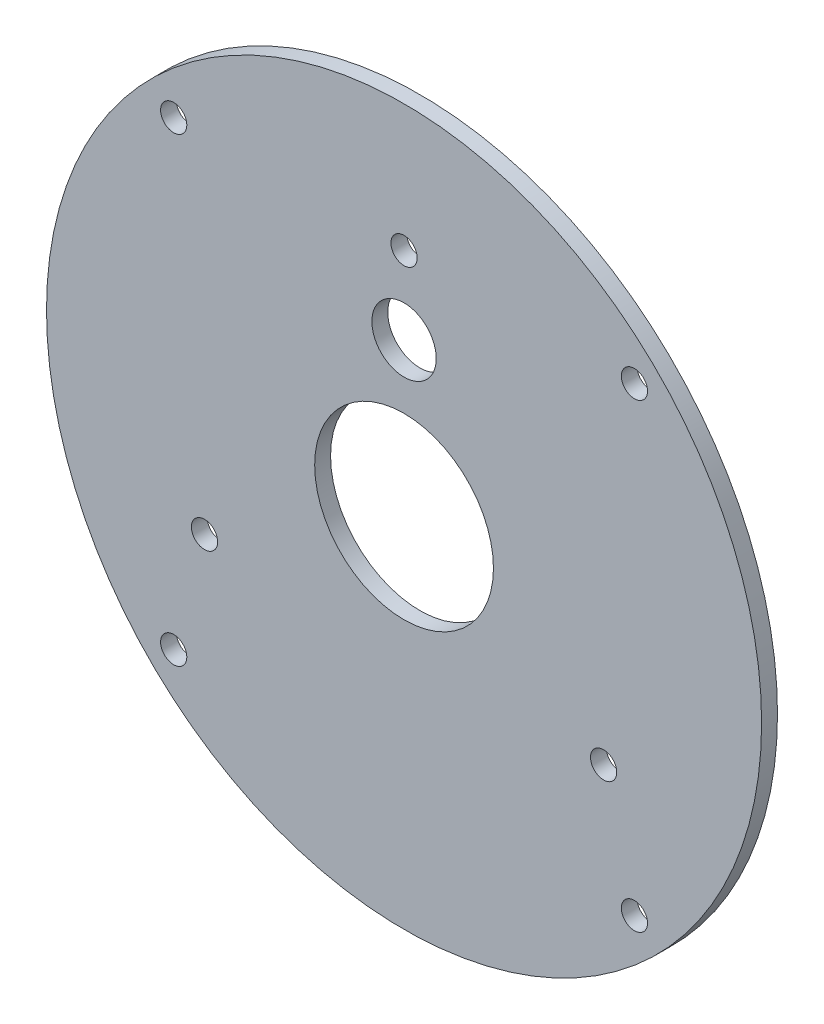
ISO-10303-21;
HEADER;
FILE_DESCRIPTION(('STEP AP214'),'2;1');
FILE_NAME('part.step','',(''),(''),'','','');
FILE_SCHEMA(('AUTOMOTIVE_DESIGN { 1 0 10303 214 1 1 1 1 }'));
ENDSEC;
DATA;
#1=APPLICATION_CONTEXT('core data for automotive mechanical design processes');
#2=APPLICATION_PROTOCOL_DEFINITION('international standard','automotive_design',2000,#1);
#3=PRODUCT_CONTEXT('',#1,'mechanical');
#4=PRODUCT('Part','Part','',(#3));
#5=PRODUCT_RELATED_PRODUCT_CATEGORY('part','',(#4));
#6=PRODUCT_DEFINITION_FORMATION('','',#4);
#7=PRODUCT_DEFINITION_CONTEXT('part definition',#1,'design');
#8=PRODUCT_DEFINITION('design','',#6,#7);
#9=PRODUCT_DEFINITION_SHAPE('','',#8);
#10=(LENGTH_UNIT() NAMED_UNIT(*) SI_UNIT(.MILLI.,.METRE.));
#11=(NAMED_UNIT(*) PLANE_ANGLE_UNIT() SI_UNIT($,.RADIAN.));
#12=(NAMED_UNIT(*) SI_UNIT($,.STERADIAN.) SOLID_ANGLE_UNIT());
#13=UNCERTAINTY_MEASURE_WITH_UNIT(LENGTH_MEASURE(1.E-05),#10,'distance_accuracy_value','');
#14=(GEOMETRIC_REPRESENTATION_CONTEXT(3) GLOBAL_UNCERTAINTY_ASSIGNED_CONTEXT((#13)) GLOBAL_UNIT_ASSIGNED_CONTEXT((#10,
#11,#12)) REPRESENTATION_CONTEXT('',''));
#15=CARTESIAN_POINT('',(0.,0.,0.));
#16=DIRECTION('',(0.,0.,1.));
#17=DIRECTION('',(1.,0.,0.));
#18=AXIS2_PLACEMENT_3D('',#15,#16,#17);
#19=CARTESIAN_POINT('',(0.,0.,10.));
#20=DIRECTION('',(0.,0.,-1.));
#21=DIRECTION('',(-1.,0.,0.));
#22=AXIS2_PLACEMENT_3D('',#19,#20,#21);
#23=CYLINDRICAL_SURFACE('',#22,45.);
#24=CARTESIAN_POINT('',(0.,0.,10.));
#25=DIRECTION('',(0.,0.,1.));
#26=DIRECTION('',(1.,0.,0.));
#27=AXIS2_PLACEMENT_3D('',#24,#25,#26);
#28=CIRCLE('',#27,45.);
#29=CARTESIAN_POINT('',(45.,0.,10.));
#30=VERTEX_POINT('',#29);
#31=EDGE_CURVE('E10',#30,#30,#28,.T.);
#32=ORIENTED_EDGE('',*,*,#31,.F.);
#33=EDGE_LOOP('',(#32));
#34=FACE_BOUND('',#33,.T.);
#35=CARTESIAN_POINT('',(0.,0.,8.));
#36=DIRECTION('',(0.,0.,-1.));
#37=DIRECTION('',(-1.,0.,0.));
#38=AXIS2_PLACEMENT_3D('',#35,#36,#37);
#39=CIRCLE('',#38,45.);
#40=CARTESIAN_POINT('',(-45.,0.,8.));
#41=VERTEX_POINT('',#40);
#42=EDGE_CURVE('E88',#41,#41,#39,.T.);
#43=ORIENTED_EDGE('',*,*,#42,.F.);
#44=EDGE_LOOP('',(#43));
#45=FACE_BOUND('',#44,.T.);
#46=ADVANCED_FACE('F33',(#34,#45),#23,.T.);
#47=CARTESIAN_POINT('',(-25.1147367097487,-14.5,10.));
#48=DIRECTION('',(0.,0.,-1.));
#49=DIRECTION('',(-1.,0.,0.));
#50=AXIS2_PLACEMENT_3D('',#47,#48,#49);
#51=CYLINDRICAL_SURFACE('',#50,1.65);
#52=CARTESIAN_POINT('',(-25.1147367097487,-14.5,10.));
#53=DIRECTION('',(0.,0.,1.));
#54=DIRECTION('',(1.,0.,0.));
#55=AXIS2_PLACEMENT_3D('',#52,#53,#54);
#56=CIRCLE('',#55,1.65);
#57=CARTESIAN_POINT('',(-23.4647367097487,-14.5,10.));
#58=VERTEX_POINT('',#57);
#59=EDGE_CURVE('E55',#58,#58,#56,.T.);
#60=ORIENTED_EDGE('',*,*,#59,.T.);
#61=EDGE_LOOP('',(#60));
#62=FACE_BOUND('',#61,.T.);
#63=CARTESIAN_POINT('',(-25.1147367097487,-14.5,8.));
#64=DIRECTION('',(0.,0.,-1.));
#65=DIRECTION('',(-1.,0.,0.));
#66=AXIS2_PLACEMENT_3D('',#63,#64,#65);
#67=CIRCLE('',#66,1.65);
#68=CARTESIAN_POINT('',(-26.7647367097487,-14.5,8.));
#69=VERTEX_POINT('',#68);
#70=EDGE_CURVE('E67',#69,#69,#67,.T.);
#71=ORIENTED_EDGE('',*,*,#70,.T.);
#72=EDGE_LOOP('',(#71));
#73=FACE_BOUND('',#72,.T.);
#74=ADVANCED_FACE('F141',(#62,#73),#51,.F.);
#75=CARTESIAN_POINT('',(0.,29.,10.));
#76=DIRECTION('',(0.,0.,-1.));
#77=DIRECTION('',(-1.,0.,0.));
#78=AXIS2_PLACEMENT_3D('',#75,#76,#77);
#79=CYLINDRICAL_SURFACE('',#78,1.65);
#80=CARTESIAN_POINT('',(0.,29.,10.));
#81=DIRECTION('',(0.,0.,1.));
#82=DIRECTION('',(1.,0.,0.));
#83=AXIS2_PLACEMENT_3D('',#80,#81,#82);
#84=CIRCLE('',#83,1.65);
#85=CARTESIAN_POINT('',(1.65,29.,10.));
#86=VERTEX_POINT('',#85);
#87=EDGE_CURVE('E58',#86,#86,#84,.T.);
#88=ORIENTED_EDGE('',*,*,#87,.T.);
#89=EDGE_LOOP('',(#88));
#90=FACE_BOUND('',#89,.T.);
#91=CARTESIAN_POINT('',(0.,29.,8.));
#92=DIRECTION('',(0.,0.,-1.));
#93=DIRECTION('',(-1.,0.,0.));
#94=AXIS2_PLACEMENT_3D('',#91,#92,#93);
#95=CIRCLE('',#94,1.65);
#96=CARTESIAN_POINT('',(-1.65000000000001,29.,8.));
#97=VERTEX_POINT('',#96);
#98=EDGE_CURVE('E70',#97,#97,#95,.T.);
#99=ORIENTED_EDGE('',*,*,#98,.T.);
#100=EDGE_LOOP('',(#99));
#101=FACE_BOUND('',#100,.T.);
#102=ADVANCED_FACE('F137',(#90,#101),#79,.F.);
#103=CARTESIAN_POINT('',(25.1147367097487,-14.5,10.));
#104=DIRECTION('',(0.,0.,-1.));
#105=DIRECTION('',(-1.,0.,0.));
#106=AXIS2_PLACEMENT_3D('',#103,#104,#105);
#107=CYLINDRICAL_SURFACE('',#106,1.65);
#108=CARTESIAN_POINT('',(25.1147367097487,-14.5,10.));
#109=DIRECTION('',(0.,0.,1.));
#110=DIRECTION('',(1.,0.,0.));
#111=AXIS2_PLACEMENT_3D('',#108,#109,#110);
#112=CIRCLE('',#111,1.65);
#113=CARTESIAN_POINT('',(26.7647367097487,-14.5,10.));
#114=VERTEX_POINT('',#113);
#115=EDGE_CURVE('E61',#114,#114,#112,.T.);
#116=ORIENTED_EDGE('',*,*,#115,.T.);
#117=EDGE_LOOP('',(#116));
#118=FACE_BOUND('',#117,.T.);
#119=CARTESIAN_POINT('',(25.1147367097487,-14.5,8.));
#120=DIRECTION('',(0.,0.,-1.));
#121=DIRECTION('',(-1.,0.,0.));
#122=AXIS2_PLACEMENT_3D('',#119,#120,#121);
#123=CIRCLE('',#122,1.65);
#124=CARTESIAN_POINT('',(23.4647367097487,-14.5,8.));
#125=VERTEX_POINT('',#124);
#126=EDGE_CURVE('E73',#125,#125,#123,.T.);
#127=ORIENTED_EDGE('',*,*,#126,.T.);
#128=EDGE_LOOP('',(#127));
#129=FACE_BOUND('',#128,.T.);
#130=ADVANCED_FACE('F127',(#118,#129),#107,.F.);
#131=CARTESIAN_POINT('',(0.,19.25,-2.));
#132=DIRECTION('',(0.,0.,1.));
#133=DIRECTION('',(1.,0.,0.));
#134=AXIS2_PLACEMENT_3D('',#131,#132,#133);
#135=CYLINDRICAL_SURFACE('',#134,4.05);
#136=CARTESIAN_POINT('',(0.,19.25,10.));
#137=DIRECTION('',(0.,0.,1.));
#138=DIRECTION('',(1.,0.,0.));
#139=AXIS2_PLACEMENT_3D('',#136,#137,#138);
#140=CIRCLE('',#139,4.05);
#141=CARTESIAN_POINT('',(4.05,19.25,10.));
#142=VERTEX_POINT('',#141);
#143=EDGE_CURVE('E64',#142,#142,#140,.T.);
#144=ORIENTED_EDGE('',*,*,#143,.T.);
#145=EDGE_LOOP('',(#144));
#146=FACE_BOUND('',#145,.T.);
#147=CARTESIAN_POINT('',(0.,19.25,8.));
#148=DIRECTION('',(0.,0.,-1.));
#149=DIRECTION('',(-1.,0.,0.));
#150=AXIS2_PLACEMENT_3D('',#147,#148,#149);
#151=CIRCLE('',#150,4.05);
#152=CARTESIAN_POINT('',(-4.05,19.25,8.));
#153=VERTEX_POINT('',#152);
#154=EDGE_CURVE('E76',#153,#153,#151,.F.);
#155=ORIENTED_EDGE('',*,*,#154,.F.);
#156=EDGE_LOOP('',(#155));
#157=FACE_BOUND('',#156,.T.);
#158=ADVANCED_FACE('F124',(#146,#157),#135,.F.);
#159=CARTESIAN_POINT('',(-28.9913780286484,28.9913780286484,10.));
#160=DIRECTION('',(0.,0.,-1.));
#161=DIRECTION('',(-1.,0.,0.));
#162=AXIS2_PLACEMENT_3D('',#159,#160,#161);
#163=CYLINDRICAL_SURFACE('',#162,1.65);
#164=CARTESIAN_POINT('',(-28.9913780286484,28.9913780286484,10.));
#165=DIRECTION('',(0.,0.,1.));
#166=DIRECTION('',(1.,0.,0.));
#167=AXIS2_PLACEMENT_3D('',#164,#165,#166);
#168=CIRCLE('',#167,1.65);
#169=CARTESIAN_POINT('',(-27.3413780286484,28.9913780286484,10.));
#170=VERTEX_POINT('',#169);
#171=EDGE_CURVE('E40',#170,#170,#168,.T.);
#172=ORIENTED_EDGE('',*,*,#171,.T.);
#173=EDGE_LOOP('',(#172));
#174=FACE_BOUND('',#173,.T.);
#175=CARTESIAN_POINT('',(-28.9913780286484,28.9913780286484,8.));
#176=DIRECTION('',(0.,0.,-1.));
#177=DIRECTION('',(-1.,0.,0.));
#178=AXIS2_PLACEMENT_3D('',#175,#176,#177);
#179=CIRCLE('',#178,1.65);
#180=CARTESIAN_POINT('',(-30.6413780286484,28.9913780286484,8.));
#181=VERTEX_POINT('',#180);
#182=EDGE_CURVE('E79',#181,#181,#179,.T.);
#183=ORIENTED_EDGE('',*,*,#182,.T.);
#184=EDGE_LOOP('',(#183));
#185=FACE_BOUND('',#184,.T.);
#186=ADVANCED_FACE('F126',(#174,#185),#163,.F.);
#187=CARTESIAN_POINT('',(28.9913780286484,28.9913780286485,10.));
#188=DIRECTION('',(0.,0.,-1.));
#189=DIRECTION('',(-1.,0.,0.));
#190=AXIS2_PLACEMENT_3D('',#187,#188,#189);
#191=CYLINDRICAL_SURFACE('',#190,1.65);
#192=CARTESIAN_POINT('',(28.9913780286484,28.9913780286485,10.));
#193=DIRECTION('',(0.,0.,1.));
#194=DIRECTION('',(1.,0.,0.));
#195=AXIS2_PLACEMENT_3D('',#192,#193,#194);
#196=CIRCLE('',#195,1.65);
#197=CARTESIAN_POINT('',(30.6413780286485,28.9913780286485,10.));
#198=VERTEX_POINT('',#197);
#199=EDGE_CURVE('E44',#198,#198,#196,.T.);
#200=ORIENTED_EDGE('',*,*,#199,.T.);
#201=EDGE_LOOP('',(#200));
#202=FACE_BOUND('',#201,.T.);
#203=CARTESIAN_POINT('',(28.9913780286484,28.9913780286485,8.));
#204=DIRECTION('',(0.,0.,-1.));
#205=DIRECTION('',(-1.,0.,0.));
#206=AXIS2_PLACEMENT_3D('',#203,#204,#205);
#207=CIRCLE('',#206,1.65);
#208=CARTESIAN_POINT('',(27.3413780286484,28.9913780286485,8.));
#209=VERTEX_POINT('',#208);
#210=EDGE_CURVE('E82',#209,#209,#207,.T.);
#211=ORIENTED_EDGE('',*,*,#210,.T.);
#212=EDGE_LOOP('',(#211));
#213=FACE_BOUND('',#212,.T.);
#214=ADVANCED_FACE('F134',(#202,#213),#191,.F.);
#215=CARTESIAN_POINT('',(-28.9913780286484,-28.9913780286484,10.));
#216=DIRECTION('',(0.,0.,-1.));
#217=DIRECTION('',(-1.,0.,0.));
#218=AXIS2_PLACEMENT_3D('',#215,#216,#217);
#219=CYLINDRICAL_SURFACE('',#218,1.65);
#220=CARTESIAN_POINT('',(-28.9913780286484,-28.9913780286484,10.));
#221=DIRECTION('',(0.,0.,1.));
#222=DIRECTION('',(1.,0.,0.));
#223=AXIS2_PLACEMENT_3D('',#220,#221,#222);
#224=CIRCLE('',#223,1.65);
#225=CARTESIAN_POINT('',(-27.3413780286484,-28.9913780286484,10.));
#226=VERTEX_POINT('',#225);
#227=EDGE_CURVE('E49',#226,#226,#224,.T.);
#228=ORIENTED_EDGE('',*,*,#227,.T.);
#229=EDGE_LOOP('',(#228));
#230=FACE_BOUND('',#229,.T.);
#231=CARTESIAN_POINT('',(-28.9913780286484,-28.9913780286484,8.));
#232=DIRECTION('',(0.,0.,-1.));
#233=DIRECTION('',(-1.,0.,0.));
#234=AXIS2_PLACEMENT_3D('',#231,#232,#233);
#235=CIRCLE('',#234,1.65);
#236=CARTESIAN_POINT('',(-30.6413780286484,-28.9913780286484,8.));
#237=VERTEX_POINT('',#236);
#238=EDGE_CURVE('E85',#237,#237,#235,.T.);
#239=ORIENTED_EDGE('',*,*,#238,.T.);
#240=EDGE_LOOP('',(#239));
#241=FACE_BOUND('',#240,.T.);
#242=ADVANCED_FACE('F159',(#230,#241),#219,.F.);
#243=CARTESIAN_POINT('',(28.9913780286484,-28.9913780286484,10.));
#244=DIRECTION('',(0.,0.,-1.));
#245=DIRECTION('',(-1.,0.,0.));
#246=AXIS2_PLACEMENT_3D('',#243,#244,#245);
#247=CYLINDRICAL_SURFACE('',#246,1.65);
#248=CARTESIAN_POINT('',(28.9913780286484,-28.9913780286484,10.));
#249=DIRECTION('',(0.,0.,1.));
#250=DIRECTION('',(1.,0.,0.));
#251=AXIS2_PLACEMENT_3D('',#248,#249,#250);
#252=CIRCLE('',#251,1.65);
#253=CARTESIAN_POINT('',(30.6413780286485,-28.9913780286484,10.));
#254=VERTEX_POINT('',#253);
#255=EDGE_CURVE('E52',#254,#254,#252,.T.);
#256=ORIENTED_EDGE('',*,*,#255,.T.);
#257=EDGE_LOOP('',(#256));
#258=FACE_BOUND('',#257,.T.);
#259=CARTESIAN_POINT('',(28.9913780286484,-28.9913780286484,8.));
#260=DIRECTION('',(0.,0.,-1.));
#261=DIRECTION('',(-1.,0.,0.));
#262=AXIS2_PLACEMENT_3D('',#259,#260,#261);
#263=CIRCLE('',#262,1.65);
#264=CARTESIAN_POINT('',(27.3413780286484,-28.9913780286484,8.));
#265=VERTEX_POINT('',#264);
#266=EDGE_CURVE('E36',#265,#265,#263,.T.);
#267=ORIENTED_EDGE('',*,*,#266,.T.);
#268=EDGE_LOOP('',(#267));
#269=FACE_BOUND('',#268,.T.);
#270=ADVANCED_FACE('F156',(#258,#269),#247,.F.);
#271=CARTESIAN_POINT('',(0.,0.,10.));
#272=DIRECTION('',(0.,0.,1.));
#273=DIRECTION('',(1.,0.,0.));
#274=AXIS2_PLACEMENT_3D('',#271,#272,#273);
#275=PLANE('',#274);
#276=CARTESIAN_POINT('',(0.,0.,10.));
#277=DIRECTION('',(0.,0.,1.));
#278=DIRECTION('',(1.,0.,0.));
#279=AXIS2_PLACEMENT_3D('',#276,#277,#278);
#280=CIRCLE('',#279,11.25);
#281=CARTESIAN_POINT('',(11.25,0.,10.));
#282=VERTEX_POINT('',#281);
#283=EDGE_CURVE('E91',#282,#282,#280,.T.);
#284=ORIENTED_EDGE('',*,*,#283,.F.);
#285=EDGE_LOOP('',(#284));
#286=FACE_BOUND('',#285,.T.);
#287=ORIENTED_EDGE('',*,*,#143,.F.);
#288=EDGE_LOOP('',(#287));
#289=FACE_BOUND('',#288,.T.);
#290=ORIENTED_EDGE('',*,*,#115,.F.);
#291=EDGE_LOOP('',(#290));
#292=FACE_BOUND('',#291,.T.);
#293=ORIENTED_EDGE('',*,*,#59,.F.);
#294=EDGE_LOOP('',(#293));
#295=FACE_BOUND('',#294,.T.);
#296=ORIENTED_EDGE('',*,*,#227,.F.);
#297=EDGE_LOOP('',(#296));
#298=FACE_BOUND('',#297,.T.);
#299=ORIENTED_EDGE('',*,*,#171,.F.);
#300=EDGE_LOOP('',(#299));
#301=FACE_BOUND('',#300,.T.);
#302=ORIENTED_EDGE('',*,*,#31,.T.);
#303=EDGE_LOOP('',(#302));
#304=FACE_BOUND('',#303,.T.);
#305=ORIENTED_EDGE('',*,*,#199,.F.);
#306=EDGE_LOOP('',(#305));
#307=FACE_BOUND('',#306,.T.);
#308=ORIENTED_EDGE('',*,*,#255,.F.);
#309=EDGE_LOOP('',(#308));
#310=FACE_BOUND('',#309,.T.);
#311=ORIENTED_EDGE('',*,*,#87,.F.);
#312=EDGE_LOOP('',(#311));
#313=FACE_BOUND('',#312,.T.);
#314=ADVANCED_FACE('F103',(#286,#289,#292,#295,#298,#301,#304,#307,#310,#313),#275,.T.);
#315=CARTESIAN_POINT('',(0.,0.,8.));
#316=DIRECTION('',(0.,0.,-1.));
#317=DIRECTION('',(-1.,0.,0.));
#318=AXIS2_PLACEMENT_3D('',#315,#316,#317);
#319=PLANE('',#318);
#320=CARTESIAN_POINT('',(0.,0.,8.));
#321=DIRECTION('',(0.,0.,-1.));
#322=DIRECTION('',(-1.,0.,0.));
#323=AXIS2_PLACEMENT_3D('',#320,#321,#322);
#324=CIRCLE('',#323,11.25);
#325=CARTESIAN_POINT('',(-11.25,0.,8.));
#326=VERTEX_POINT('',#325);
#327=EDGE_CURVE('E94',#326,#326,#324,.T.);
#328=ORIENTED_EDGE('',*,*,#327,.F.);
#329=EDGE_LOOP('',(#328));
#330=FACE_BOUND('',#329,.T.);
#331=ORIENTED_EDGE('',*,*,#70,.F.);
#332=EDGE_LOOP('',(#331));
#333=FACE_BOUND('',#332,.T.);
#334=ORIENTED_EDGE('',*,*,#98,.F.);
#335=EDGE_LOOP('',(#334));
#336=FACE_BOUND('',#335,.T.);
#337=ORIENTED_EDGE('',*,*,#126,.F.);
#338=EDGE_LOOP('',(#337));
#339=FACE_BOUND('',#338,.T.);
#340=ORIENTED_EDGE('',*,*,#182,.F.);
#341=EDGE_LOOP('',(#340));
#342=FACE_BOUND('',#341,.T.);
#343=ORIENTED_EDGE('',*,*,#210,.F.);
#344=EDGE_LOOP('',(#343));
#345=FACE_BOUND('',#344,.T.);
#346=ORIENTED_EDGE('',*,*,#238,.F.);
#347=EDGE_LOOP('',(#346));
#348=FACE_BOUND('',#347,.T.);
#349=ORIENTED_EDGE('',*,*,#266,.F.);
#350=EDGE_LOOP('',(#349));
#351=FACE_BOUND('',#350,.T.);
#352=ORIENTED_EDGE('',*,*,#42,.T.);
#353=EDGE_LOOP('',(#352));
#354=FACE_BOUND('',#353,.T.);
#355=ORIENTED_EDGE('',*,*,#154,.T.);
#356=EDGE_LOOP('',(#355));
#357=FACE_BOUND('',#356,.T.);
#358=ADVANCED_FACE('F100',(#330,#333,#336,#339,#342,#345,#348,#351,#354,#357),#319,.T.);
#359=CARTESIAN_POINT('',(0.,0.,18.));
#360=DIRECTION('',(0.,0.,-1.));
#361=DIRECTION('',(-1.,0.,0.));
#362=AXIS2_PLACEMENT_3D('',#359,#360,#361);
#363=CYLINDRICAL_SURFACE('',#362,11.25);
#364=ORIENTED_EDGE('',*,*,#283,.T.);
#365=EDGE_LOOP('',(#364));
#366=FACE_BOUND('',#365,.T.);
#367=ORIENTED_EDGE('',*,*,#327,.T.);
#368=EDGE_LOOP('',(#367));
#369=FACE_BOUND('',#368,.T.);
#370=ADVANCED_FACE('F98',(#366,#369),#363,.F.);
#371=CLOSED_SHELL('',(#46,#74,#102,#130,#158,#186,#214,#242,#270,#314,#358,#370));
#372=MANIFOLD_SOLID_BREP('B2',#371);
#373=ADVANCED_BREP_SHAPE_REPRESENTATION('',(#18,#372),#14);
#374=SHAPE_DEFINITION_REPRESENTATION(#9,#373);
ENDSEC;
END-ISO-10303-21;
